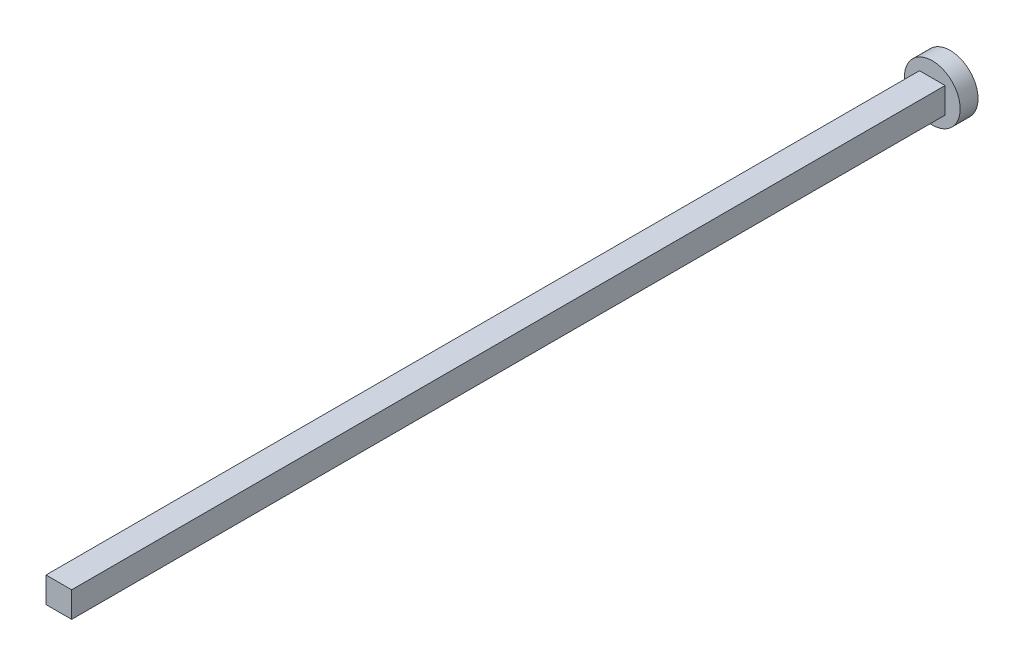
ISO-10303-21;
HEADER;
FILE_DESCRIPTION(('STEP AP214'),'2;1');
FILE_NAME('part.step','',(''),(''),'','','');
FILE_SCHEMA(('AUTOMOTIVE_DESIGN { 1 0 10303 214 1 1 1 1 }'));
ENDSEC;
DATA;
#1=APPLICATION_CONTEXT('core data for automotive mechanical design processes');
#2=APPLICATION_PROTOCOL_DEFINITION('international standard','automotive_design',2000,#1);
#3=PRODUCT_CONTEXT('',#1,'mechanical');
#4=PRODUCT('Part','Part','',(#3));
#5=PRODUCT_RELATED_PRODUCT_CATEGORY('part','',(#4));
#6=PRODUCT_DEFINITION_FORMATION('','',#4);
#7=PRODUCT_DEFINITION_CONTEXT('part definition',#1,'design');
#8=PRODUCT_DEFINITION('design','',#6,#7);
#9=PRODUCT_DEFINITION_SHAPE('','',#8);
#10=(LENGTH_UNIT() NAMED_UNIT(*) SI_UNIT(.MILLI.,.METRE.));
#11=(NAMED_UNIT(*) PLANE_ANGLE_UNIT() SI_UNIT($,.RADIAN.));
#12=(NAMED_UNIT(*) SI_UNIT($,.STERADIAN.) SOLID_ANGLE_UNIT());
#13=UNCERTAINTY_MEASURE_WITH_UNIT(LENGTH_MEASURE(1.E-05),#10,'distance_accuracy_value','');
#14=(GEOMETRIC_REPRESENTATION_CONTEXT(3) GLOBAL_UNCERTAINTY_ASSIGNED_CONTEXT((#13)) GLOBAL_UNIT_ASSIGNED_CONTEXT((#10,
#11,#12)) REPRESENTATION_CONTEXT('',''));
#15=CARTESIAN_POINT('',(0.,0.,0.));
#16=DIRECTION('',(0.,0.,1.));
#17=DIRECTION('',(1.,0.,0.));
#18=AXIS2_PLACEMENT_3D('',#15,#16,#17);
#19=CARTESIAN_POINT('',(1.43379802499999,-1.433798025,97.650000052));
#20=DIRECTION('',(-1.,0.,0.));
#21=DIRECTION('',(0.,0.,1.));
#22=AXIS2_PLACEMENT_3D('',#19,#20,#21);
#23=PLANE('',#22);
#24=DIRECTION('',(0.,1.,0.));
#25=VECTOR('',#24,1.);
#26=CARTESIAN_POINT('',(1.43379802499999,-1.433798025,0.));
#27=LINE('',#26,#25);
#28=CARTESIAN_POINT('',(1.43379802499999,-1.433798025,0.));
#29=VERTEX_POINT('',#28);
#30=CARTESIAN_POINT('',(1.43379802499999,1.433798025,0.));
#31=VERTEX_POINT('',#30);
#32=EDGE_CURVE('E79',#29,#31,#27,.T.);
#33=ORIENTED_EDGE('',*,*,#32,.T.);
#34=DIRECTION('',(0.,0.,-1.));
#35=VECTOR('',#34,1.);
#36=CARTESIAN_POINT('',(1.43379802499999,1.433798025,97.650000052));
#37=LINE('',#36,#35);
#38=CARTESIAN_POINT('',(1.43379802499999,1.433798025,97.650000052));
#39=VERTEX_POINT('',#38);
#40=EDGE_CURVE('E11',#39,#31,#37,.T.);
#41=ORIENTED_EDGE('',*,*,#40,.F.);
#42=DIRECTION('',(0.,1.,0.));
#43=VECTOR('',#42,1.);
#44=CARTESIAN_POINT('',(1.43379802499999,-1.433798025,97.650000052));
#45=LINE('',#44,#43);
#46=CARTESIAN_POINT('',(1.43379802499999,-1.433798025,97.650000052));
#47=VERTEX_POINT('',#46);
#48=EDGE_CURVE('E105',#47,#39,#45,.T.);
#49=ORIENTED_EDGE('',*,*,#48,.F.);
#50=DIRECTION('',(0.,0.,-1.));
#51=VECTOR('',#50,1.);
#52=CARTESIAN_POINT('',(1.43379802499999,-1.433798025,97.650000052));
#53=LINE('',#52,#51);
#54=EDGE_CURVE('E93',#47,#29,#53,.T.);
#55=ORIENTED_EDGE('',*,*,#54,.T.);
#56=EDGE_LOOP('',(#33,#41,#49,#55));
#57=FACE_BOUND('',#56,.T.);
#58=ADVANCED_FACE('F39',(#57),#23,.F.);
#59=CARTESIAN_POINT('',(-1.43379802499999,1.433798025,97.650000052));
#60=DIRECTION('',(0.,-1.,0.));
#61=DIRECTION('',(0.,0.,-1.));
#62=AXIS2_PLACEMENT_3D('',#59,#60,#61);
#63=PLANE('',#62);
#64=DIRECTION('',(-1.,0.,0.));
#65=VECTOR('',#64,1.);
#66=CARTESIAN_POINT('',(-1.43379802499999,1.433798025,0.));
#67=LINE('',#66,#65);
#68=CARTESIAN_POINT('',(-1.43379802499999,1.433798025,0.));
#69=VERTEX_POINT('',#68);
#70=EDGE_CURVE('E75',#31,#69,#67,.T.);
#71=ORIENTED_EDGE('',*,*,#70,.T.);
#72=DIRECTION('',(0.,0.,-1.));
#73=VECTOR('',#72,1.);
#74=CARTESIAN_POINT('',(-1.43379802499999,1.433798025,97.650000052));
#75=LINE('',#74,#73);
#76=CARTESIAN_POINT('',(-1.43379802499999,1.433798025,97.650000052));
#77=VERTEX_POINT('',#76);
#78=EDGE_CURVE('E47',#77,#69,#75,.T.);
#79=ORIENTED_EDGE('',*,*,#78,.F.);
#80=DIRECTION('',(-1.,0.,0.));
#81=VECTOR('',#80,1.);
#82=CARTESIAN_POINT('',(-1.43379802499999,1.433798025,97.650000052));
#83=LINE('',#82,#81);
#84=EDGE_CURVE('E89',#39,#77,#83,.T.);
#85=ORIENTED_EDGE('',*,*,#84,.F.);
#86=ORIENTED_EDGE('',*,*,#40,.T.);
#87=EDGE_LOOP('',(#71,#79,#85,#86));
#88=FACE_BOUND('',#87,.T.);
#89=ADVANCED_FACE('F88',(#88),#63,.F.);
#90=CARTESIAN_POINT('',(-1.43379802499999,-1.433798025,97.650000052));
#91=DIRECTION('',(1.,0.,0.));
#92=DIRECTION('',(0.,0.,-1.));
#93=AXIS2_PLACEMENT_3D('',#90,#91,#92);
#94=PLANE('',#93);
#95=DIRECTION('',(0.,-1.,0.));
#96=VECTOR('',#95,1.);
#97=CARTESIAN_POINT('',(-1.43379802499999,-1.433798025,0.));
#98=LINE('',#97,#96);
#99=CARTESIAN_POINT('',(-1.43379802499999,-1.433798025,0.));
#100=VERTEX_POINT('',#99);
#101=EDGE_CURVE('E82',#69,#100,#98,.T.);
#102=ORIENTED_EDGE('',*,*,#101,.T.);
#103=DIRECTION('',(0.,0.,-1.));
#104=VECTOR('',#103,1.);
#105=CARTESIAN_POINT('',(-1.43379802499999,-1.433798025,97.650000052));
#106=LINE('',#105,#104);
#107=CARTESIAN_POINT('',(-1.43379802499999,-1.433798025,97.650000052));
#108=VERTEX_POINT('',#107);
#109=EDGE_CURVE('E107',#108,#100,#106,.T.);
#110=ORIENTED_EDGE('',*,*,#109,.F.);
#111=DIRECTION('',(0.,-1.,0.));
#112=VECTOR('',#111,1.);
#113=CARTESIAN_POINT('',(-1.43379802499999,-1.433798025,97.650000052));
#114=LINE('',#113,#112);
#115=EDGE_CURVE('E113',#77,#108,#114,.T.);
#116=ORIENTED_EDGE('',*,*,#115,.F.);
#117=ORIENTED_EDGE('',*,*,#78,.T.);
#118=EDGE_LOOP('',(#102,#110,#116,#117));
#119=FACE_BOUND('',#118,.T.);
#120=ADVANCED_FACE('F111',(#119),#94,.F.);
#121=CARTESIAN_POINT('',(-1.43379802499999,-1.433798025,97.650000052));
#122=DIRECTION('',(0.,1.,0.));
#123=DIRECTION('',(0.,0.,1.));
#124=AXIS2_PLACEMENT_3D('',#121,#122,#123);
#125=PLANE('',#124);
#126=DIRECTION('',(1.,0.,0.));
#127=VECTOR('',#126,1.);
#128=CARTESIAN_POINT('',(-1.43379802499999,-1.433798025,0.));
#129=LINE('',#128,#127);
#130=EDGE_CURVE('E103',#100,#29,#129,.T.);
#131=ORIENTED_EDGE('',*,*,#130,.T.);
#132=ORIENTED_EDGE('',*,*,#54,.F.);
#133=DIRECTION('',(1.,0.,0.));
#134=VECTOR('',#133,1.);
#135=CARTESIAN_POINT('',(-1.43379802499999,-1.433798025,97.650000052));
#136=LINE('',#135,#134);
#137=EDGE_CURVE('E54',#108,#47,#136,.T.);
#138=ORIENTED_EDGE('',*,*,#137,.F.);
#139=ORIENTED_EDGE('',*,*,#109,.T.);
#140=EDGE_LOOP('',(#131,#132,#138,#139));
#141=FACE_BOUND('',#140,.T.);
#142=ADVANCED_FACE('F137',(#141),#125,.F.);
#143=CARTESIAN_POINT('',(0.,0.,97.650000052));
#144=DIRECTION('',(0.,0.,-1.));
#145=DIRECTION('',(-1.,0.,0.));
#146=AXIS2_PLACEMENT_3D('',#143,#144,#145);
#147=PLANE('',#146);
#148=ORIENTED_EDGE('',*,*,#48,.T.);
#149=ORIENTED_EDGE('',*,*,#84,.T.);
#150=ORIENTED_EDGE('',*,*,#115,.T.);
#151=ORIENTED_EDGE('',*,*,#137,.T.);
#152=EDGE_LOOP('',(#148,#149,#150,#151));
#153=FACE_BOUND('',#152,.T.);
#154=ADVANCED_FACE('F142',(#153),#147,.F.);
#155=CARTESIAN_POINT('',(0.,0.,-2.));
#156=DIRECTION('',(0.,0.,1.));
#157=DIRECTION('',(1.,0.,0.));
#158=AXIS2_PLACEMENT_3D('',#155,#156,#157);
#159=CYLINDRICAL_SURFACE('',#158,3.11618763072831);
#160=CARTESIAN_POINT('',(0.,0.,-2.));
#161=DIRECTION('',(0.,0.,-1.));
#162=DIRECTION('',(-1.,0.,0.));
#163=AXIS2_PLACEMENT_3D('',#160,#161,#162);
#164=CIRCLE('',#163,3.11618763072831);
#165=CARTESIAN_POINT('',(-3.11618763072831,0.,-2.));
#166=VERTEX_POINT('',#165);
#167=EDGE_CURVE('E94',#166,#166,#164,.T.);
#168=ORIENTED_EDGE('',*,*,#167,.F.);
#169=EDGE_LOOP('',(#168));
#170=FACE_BOUND('',#169,.T.);
#171=CARTESIAN_POINT('',(0.,0.,0.));
#172=DIRECTION('',(0.,0.,-1.));
#173=DIRECTION('',(-1.,0.,0.));
#174=AXIS2_PLACEMENT_3D('',#171,#172,#173);
#175=CIRCLE('',#174,3.11618763072831);
#176=CARTESIAN_POINT('',(-3.11618763072831,0.,0.));
#177=VERTEX_POINT('',#176);
#178=EDGE_CURVE('E97',#177,#177,#175,.T.);
#179=ORIENTED_EDGE('',*,*,#178,.T.);
#180=EDGE_LOOP('',(#179));
#181=FACE_BOUND('',#180,.T.);
#182=ADVANCED_FACE('F120',(#170,#181),#159,.T.);
#183=CARTESIAN_POINT('',(0.,0.,-2.));
#184=DIRECTION('',(0.,0.,-1.));
#185=DIRECTION('',(-1.,0.,0.));
#186=AXIS2_PLACEMENT_3D('',#183,#184,#185);
#187=PLANE('',#186);
#188=ORIENTED_EDGE('',*,*,#167,.T.);
#189=EDGE_LOOP('',(#188));
#190=FACE_BOUND('',#189,.T.);
#191=ADVANCED_FACE('F122',(#190),#187,.T.);
#192=CARTESIAN_POINT('',(0.,0.,0.));
#193=DIRECTION('',(0.,0.,-1.));
#194=DIRECTION('',(-1.,0.,0.));
#195=AXIS2_PLACEMENT_3D('',#192,#193,#194);
#196=PLANE('',#195);
#197=ORIENTED_EDGE('',*,*,#32,.F.);
#198=ORIENTED_EDGE('',*,*,#130,.F.);
#199=ORIENTED_EDGE('',*,*,#101,.F.);
#200=ORIENTED_EDGE('',*,*,#70,.F.);
#201=EDGE_LOOP('',(#197,#198,#199,#200));
#202=FACE_BOUND('',#201,.T.);
#203=ORIENTED_EDGE('',*,*,#178,.F.);
#204=EDGE_LOOP('',(#203));
#205=FACE_BOUND('',#204,.T.);
#206=ADVANCED_FACE('F76',(#202,#205),#196,.F.);
#207=CLOSED_SHELL('',(#58,#89,#120,#142,#154,#182,#191,#206));
#208=MANIFOLD_SOLID_BREP('B2',#207);
#209=ADVANCED_BREP_SHAPE_REPRESENTATION('',(#18,#208),#14);
#210=SHAPE_DEFINITION_REPRESENTATION(#9,#209);
ENDSEC;
END-ISO-10303-21;
